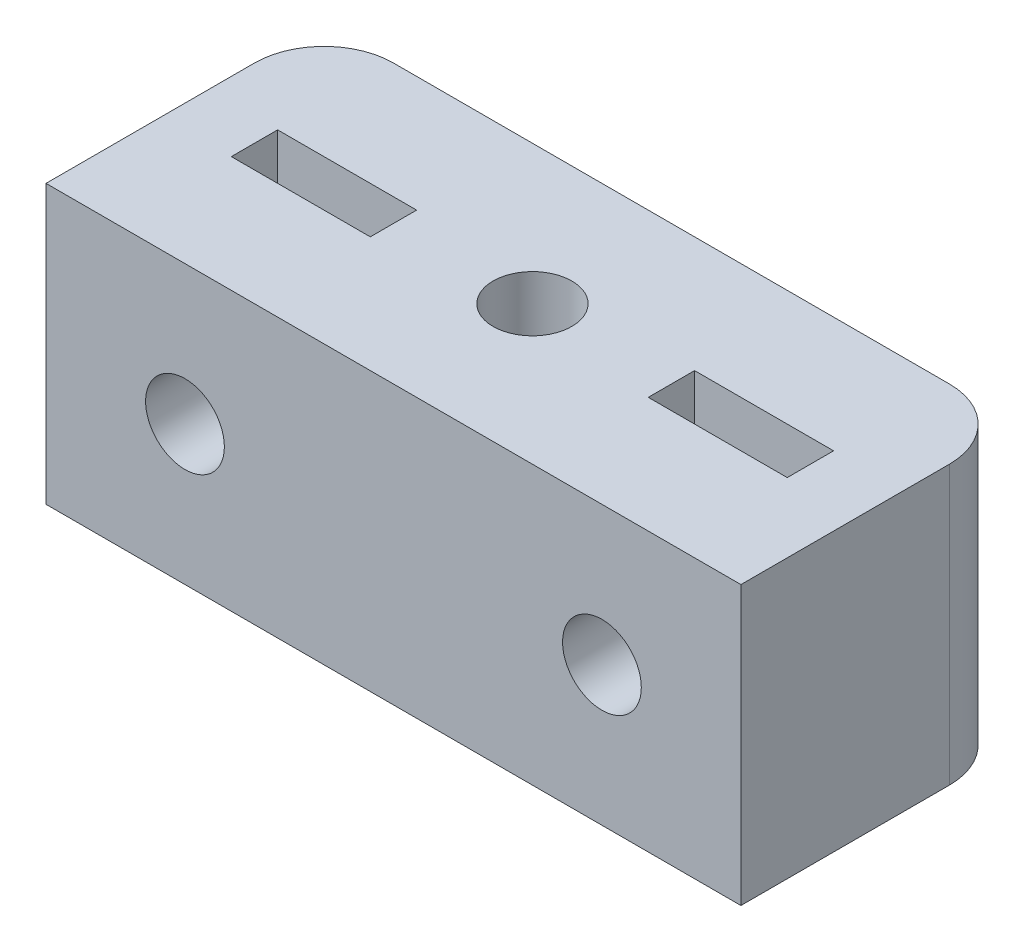
ISO-10303-21;
HEADER;
FILE_DESCRIPTION(('STEP AP214'),'2;1');
FILE_NAME('part.step','',(''),(''),'','','');
FILE_SCHEMA(('AUTOMOTIVE_DESIGN { 1 0 10303 214 1 1 1 1 }'));
ENDSEC;
DATA;
#1=APPLICATION_CONTEXT('core data for automotive mechanical design processes');
#2=APPLICATION_PROTOCOL_DEFINITION('international standard','automotive_design',2000,#1);
#3=PRODUCT_CONTEXT('',#1,'mechanical');
#4=PRODUCT('Part','Part','',(#3));
#5=PRODUCT_RELATED_PRODUCT_CATEGORY('part','',(#4));
#6=PRODUCT_DEFINITION_FORMATION('','',#4);
#7=PRODUCT_DEFINITION_CONTEXT('part definition',#1,'design');
#8=PRODUCT_DEFINITION('design','',#6,#7);
#9=PRODUCT_DEFINITION_SHAPE('','',#8);
#10=(LENGTH_UNIT() NAMED_UNIT(*) SI_UNIT(.MILLI.,.METRE.));
#11=(NAMED_UNIT(*) PLANE_ANGLE_UNIT() SI_UNIT($,.RADIAN.));
#12=(NAMED_UNIT(*) SI_UNIT($,.STERADIAN.) SOLID_ANGLE_UNIT());
#13=UNCERTAINTY_MEASURE_WITH_UNIT(LENGTH_MEASURE(1.E-05),#10,'distance_accuracy_value','');
#14=(GEOMETRIC_REPRESENTATION_CONTEXT(3) GLOBAL_UNCERTAINTY_ASSIGNED_CONTEXT((#13)) GLOBAL_UNIT_ASSIGNED_CONTEXT((#10,
#11,#12)) REPRESENTATION_CONTEXT('',''));
#15=CARTESIAN_POINT('',(0.,0.,0.));
#16=DIRECTION('',(0.,0.,1.));
#17=DIRECTION('',(1.,0.,0.));
#18=AXIS2_PLACEMENT_3D('',#15,#16,#17);
#19=CARTESIAN_POINT('',(-15.,6.,-6.));
#20=DIRECTION('',(0.,0.,1.));
#21=DIRECTION('',(1.,0.,0.));
#22=AXIS2_PLACEMENT_3D('',#19,#20,#21);
#23=PLANE('',#22);
#24=DIRECTION('',(-1.,0.,0.));
#25=VECTOR('',#24,1.);
#26=CARTESIAN_POINT('',(-15.,-6.,-6.));
#27=LINE('',#26,#25);
#28=CARTESIAN_POINT('',(12.,-6.,-6.));
#29=VERTEX_POINT('',#28);
#30=CARTESIAN_POINT('',(-12.,-6.,-6.));
#31=VERTEX_POINT('',#30);
#32=EDGE_CURVE('E298',#29,#31,#27,.T.);
#33=ORIENTED_EDGE('',*,*,#32,.T.);
#34=DIRECTION('',(0.,-1.,0.));
#35=VECTOR('',#34,1.);
#36=CARTESIAN_POINT('',(-12.,6.,-6.));
#37=LINE('',#36,#35);
#38=CARTESIAN_POINT('',(-12.,6.,-6.));
#39=VERTEX_POINT('',#38);
#40=EDGE_CURVE('E53',#31,#39,#37,.F.);
#41=ORIENTED_EDGE('',*,*,#40,.T.);
#42=DIRECTION('',(-1.,0.,0.));
#43=VECTOR('',#42,1.);
#44=CARTESIAN_POINT('',(-15.,6.,-6.));
#45=LINE('',#44,#43);
#46=CARTESIAN_POINT('',(12.,6.,-6.));
#47=VERTEX_POINT('',#46);
#48=EDGE_CURVE('E289',#47,#39,#45,.T.);
#49=ORIENTED_EDGE('',*,*,#48,.F.);
#50=DIRECTION('',(0.,-1.,0.));
#51=VECTOR('',#50,1.);
#52=CARTESIAN_POINT('',(12.,6.,-6.));
#53=LINE('',#52,#51);
#54=EDGE_CURVE('E327',#47,#29,#53,.T.);
#55=ORIENTED_EDGE('',*,*,#54,.T.);
#56=EDGE_LOOP('',(#33,#41,#49,#55));
#57=FACE_BOUND('',#56,.T.);
#58=CARTESIAN_POINT('',(-9.,0.,-6.));
#59=DIRECTION('',(0.,0.,1.));
#60=DIRECTION('',(1.,0.,0.));
#61=AXIS2_PLACEMENT_3D('',#58,#59,#60);
#62=CIRCLE('',#61,1.7);
#63=CARTESIAN_POINT('',(-7.3,0.,-6.));
#64=VERTEX_POINT('',#63);
#65=EDGE_CURVE('E279',#64,#64,#62,.T.);
#66=ORIENTED_EDGE('',*,*,#65,.T.);
#67=EDGE_LOOP('',(#66));
#68=FACE_BOUND('',#67,.T.);
#69=CARTESIAN_POINT('',(9.,0.,-6.));
#70=DIRECTION('',(0.,0.,-1.));
#71=DIRECTION('',(-1.,0.,0.));
#72=AXIS2_PLACEMENT_3D('',#69,#70,#71);
#73=CIRCLE('',#72,1.7);
#74=CARTESIAN_POINT('',(7.3,0.,-6.));
#75=VERTEX_POINT('',#74);
#76=EDGE_CURVE('E240',#75,#75,#73,.T.);
#77=ORIENTED_EDGE('',*,*,#76,.F.);
#78=EDGE_LOOP('',(#77));
#79=FACE_BOUND('',#78,.T.);
#80=DIRECTION('',(-1.,0.,0.));
#81=VECTOR('',#80,1.);
#82=CARTESIAN_POINT('',(-3.,-1.,-6.));
#83=LINE('',#82,#81);
#84=CARTESIAN_POINT('',(3.,-1.,-6.));
#85=VERTEX_POINT('',#84);
#86=CARTESIAN_POINT('',(-3.,-1.,-6.));
#87=VERTEX_POINT('',#86);
#88=EDGE_CURVE('E177',#85,#87,#83,.T.);
#89=ORIENTED_EDGE('',*,*,#88,.F.);
#90=DIRECTION('',(0.,1.,0.));
#91=VECTOR('',#90,1.);
#92=CARTESIAN_POINT('',(3.,-1.,-6.));
#93=LINE('',#92,#91);
#94=CARTESIAN_POINT('',(3.,1.,-6.));
#95=VERTEX_POINT('',#94);
#96=EDGE_CURVE('E158',#85,#95,#93,.T.);
#97=ORIENTED_EDGE('',*,*,#96,.T.);
#98=DIRECTION('',(-1.,0.,0.));
#99=VECTOR('',#98,1.);
#100=CARTESIAN_POINT('',(-3.,1.,-6.));
#101=LINE('',#100,#99);
#102=CARTESIAN_POINT('',(-3.,1.,-6.));
#103=VERTEX_POINT('',#102);
#104=EDGE_CURVE('E186',#95,#103,#101,.T.);
#105=ORIENTED_EDGE('',*,*,#104,.T.);
#106=DIRECTION('',(0.,1.,0.));
#107=VECTOR('',#106,1.);
#108=CARTESIAN_POINT('',(-3.,-1.,-6.));
#109=LINE('',#108,#107);
#110=EDGE_CURVE('E169',#87,#103,#109,.T.);
#111=ORIENTED_EDGE('',*,*,#110,.F.);
#112=EDGE_LOOP('',(#89,#97,#105,#111));
#113=FACE_BOUND('',#112,.T.);
#114=ADVANCED_FACE('F32',(#57,#68,#79,#113),#23,.F.);
#115=CARTESIAN_POINT('',(0.,-6.,0.));
#116=DIRECTION('',(0.,1.,0.));
#117=DIRECTION('',(0.,0.,1.));
#118=AXIS2_PLACEMENT_3D('',#115,#116,#117);
#119=CYLINDRICAL_SURFACE('',#118,1.7);
#120=CARTESIAN_POINT('',(0.,-6.,0.));
#121=DIRECTION('',(0.,1.,0.));
#122=DIRECTION('',(0.,0.,1.));
#123=AXIS2_PLACEMENT_3D('',#120,#121,#122);
#124=CIRCLE('',#123,1.7);
#125=CARTESIAN_POINT('',(0.,-6.,1.7));
#126=VERTEX_POINT('',#125);
#127=EDGE_CURVE('E201',#126,#126,#124,.T.);
#128=ORIENTED_EDGE('',*,*,#127,.F.);
#129=EDGE_LOOP('',(#128));
#130=FACE_BOUND('',#129,.T.);
#131=CARTESIAN_POINT('',(0.,-1.,0.));
#132=DIRECTION('',(0.,1.,0.));
#133=DIRECTION('',(0.,0.,1.));
#134=AXIS2_PLACEMENT_3D('',#131,#132,#133);
#135=CIRCLE('',#134,1.7);
#136=CARTESIAN_POINT('',(0.,-1.,1.7));
#137=VERTEX_POINT('',#136);
#138=EDGE_CURVE('E208',#137,#137,#135,.F.);
#139=ORIENTED_EDGE('',*,*,#138,.F.);
#140=EDGE_LOOP('',(#139));
#141=FACE_BOUND('',#140,.T.);
#142=ADVANCED_FACE('F371',(#130,#141),#119,.F.);
#143=CARTESIAN_POINT('',(0.,6.,0.));
#144=DIRECTION('',(0.,-1.,0.));
#145=DIRECTION('',(0.,0.,-1.));
#146=AXIS2_PLACEMENT_3D('',#143,#144,#145);
#147=PLANE('',#146);
#148=CARTESIAN_POINT('',(0.,6.,0.));
#149=DIRECTION('',(0.,1.,0.));
#150=DIRECTION('',(0.,0.,1.));
#151=AXIS2_PLACEMENT_3D('',#148,#149,#150);
#152=CIRCLE('',#151,1.7);
#153=CARTESIAN_POINT('',(0.,6.,1.7));
#154=VERTEX_POINT('',#153);
#155=EDGE_CURVE('E205',#154,#154,#152,.T.);
#156=ORIENTED_EDGE('',*,*,#155,.F.);
#157=EDGE_LOOP('',(#156));
#158=FACE_BOUND('',#157,.T.);
#159=DIRECTION('',(-1.,0.,0.));
#160=VECTOR('',#159,1.);
#161=CARTESIAN_POINT('',(-12.,6.,-1.));
#162=LINE('',#161,#160);
#163=CARTESIAN_POINT('',(-6.,6.,-1.));
#164=VERTEX_POINT('',#163);
#165=CARTESIAN_POINT('',(-12.,6.,-1.));
#166=VERTEX_POINT('',#165);
#167=EDGE_CURVE('E251',#164,#166,#162,.T.);
#168=ORIENTED_EDGE('',*,*,#167,.F.);
#169=DIRECTION('',(0.,0.,1.));
#170=VECTOR('',#169,1.);
#171=CARTESIAN_POINT('',(-6.,6.,-1.));
#172=LINE('',#171,#170);
#173=CARTESIAN_POINT('',(-6.,6.,1.));
#174=VERTEX_POINT('',#173);
#175=EDGE_CURVE('E260',#164,#174,#172,.T.);
#176=ORIENTED_EDGE('',*,*,#175,.T.);
#177=DIRECTION('',(-1.,0.,0.));
#178=VECTOR('',#177,1.);
#179=CARTESIAN_POINT('',(-12.,6.,1.));
#180=LINE('',#179,#178);
#181=CARTESIAN_POINT('',(-12.,6.,1.));
#182=VERTEX_POINT('',#181);
#183=EDGE_CURVE('E243',#174,#182,#180,.T.);
#184=ORIENTED_EDGE('',*,*,#183,.T.);
#185=DIRECTION('',(0.,0.,1.));
#186=VECTOR('',#185,1.);
#187=CARTESIAN_POINT('',(-12.,6.,-1.));
#188=LINE('',#187,#186);
#189=EDGE_CURVE('E275',#166,#182,#188,.T.);
#190=ORIENTED_EDGE('',*,*,#189,.F.);
#191=EDGE_LOOP('',(#168,#176,#184,#190));
#192=FACE_BOUND('',#191,.T.);
#193=ORIENTED_EDGE('',*,*,#48,.T.);
#194=CARTESIAN_POINT('',(-12.,6.,-3.));
#195=DIRECTION('',(0.,-1.,0.));
#196=DIRECTION('',(0.,0.,-1.));
#197=AXIS2_PLACEMENT_3D('',#194,#195,#196);
#198=CIRCLE('',#197,3.);
#199=CARTESIAN_POINT('',(-15.,6.,-3.));
#200=VERTEX_POINT('',#199);
#201=EDGE_CURVE('E40',#39,#200,#198,.F.);
#202=ORIENTED_EDGE('',*,*,#201,.T.);
#203=DIRECTION('',(0.,0.,1.));
#204=VECTOR('',#203,1.);
#205=CARTESIAN_POINT('',(-15.,6.,6.));
#206=LINE('',#205,#204);
#207=CARTESIAN_POINT('',(-15.,6.,6.));
#208=VERTEX_POINT('',#207);
#209=EDGE_CURVE('E292',#200,#208,#206,.T.);
#210=ORIENTED_EDGE('',*,*,#209,.T.);
#211=DIRECTION('',(1.,0.,0.));
#212=VECTOR('',#211,1.);
#213=CARTESIAN_POINT('',(-15.,6.,6.));
#214=LINE('',#213,#212);
#215=CARTESIAN_POINT('',(15.,6.,6.));
#216=VERTEX_POINT('',#215);
#217=EDGE_CURVE('E294',#208,#216,#214,.T.);
#218=ORIENTED_EDGE('',*,*,#217,.T.);
#219=DIRECTION('',(0.,0.,-1.));
#220=VECTOR('',#219,1.);
#221=CARTESIAN_POINT('',(15.,6.,6.));
#222=LINE('',#221,#220);
#223=CARTESIAN_POINT('',(15.,6.,-3.));
#224=VERTEX_POINT('',#223);
#225=EDGE_CURVE('E287',#216,#224,#222,.T.);
#226=ORIENTED_EDGE('',*,*,#225,.T.);
#227=CARTESIAN_POINT('',(12.,6.,-3.));
#228=DIRECTION('',(0.,-1.,0.));
#229=DIRECTION('',(0.,0.,-1.));
#230=AXIS2_PLACEMENT_3D('',#227,#228,#229);
#231=CIRCLE('',#230,3.);
#232=EDGE_CURVE('E331',#224,#47,#231,.F.);
#233=ORIENTED_EDGE('',*,*,#232,.T.);
#234=EDGE_LOOP('',(#193,#202,#210,#218,#226,#233));
#235=FACE_BOUND('',#234,.T.);
#236=DIRECTION('',(1.,0.,0.));
#237=VECTOR('',#236,1.);
#238=CARTESIAN_POINT('',(12.,6.,-1.));
#239=LINE('',#238,#237);
#240=CARTESIAN_POINT('',(6.,6.,-1.));
#241=VERTEX_POINT('',#240);
#242=CARTESIAN_POINT('',(12.,6.,-1.));
#243=VERTEX_POINT('',#242);
#244=EDGE_CURVE('E218',#241,#243,#239,.T.);
#245=ORIENTED_EDGE('',*,*,#244,.T.);
#246=DIRECTION('',(0.,0.,1.));
#247=VECTOR('',#246,1.);
#248=CARTESIAN_POINT('',(12.,6.,-1.));
#249=LINE('',#248,#247);
#250=CARTESIAN_POINT('',(12.,6.,1.));
#251=VERTEX_POINT('',#250);
#252=EDGE_CURVE('E232',#243,#251,#249,.T.);
#253=ORIENTED_EDGE('',*,*,#252,.T.);
#254=DIRECTION('',(1.,0.,0.));
#255=VECTOR('',#254,1.);
#256=CARTESIAN_POINT('',(12.,6.,1.));
#257=LINE('',#256,#255);
#258=CARTESIAN_POINT('',(6.,6.,1.));
#259=VERTEX_POINT('',#258);
#260=EDGE_CURVE('E213',#259,#251,#257,.T.);
#261=ORIENTED_EDGE('',*,*,#260,.F.);
#262=DIRECTION('',(0.,0.,1.));
#263=VECTOR('',#262,1.);
#264=CARTESIAN_POINT('',(6.,6.,-1.));
#265=LINE('',#264,#263);
#266=EDGE_CURVE('E229',#241,#259,#265,.T.);
#267=ORIENTED_EDGE('',*,*,#266,.F.);
#268=EDGE_LOOP('',(#245,#253,#261,#267));
#269=FACE_BOUND('',#268,.T.);
#270=ADVANCED_FACE('F335',(#158,#192,#235,#269),#147,.F.);
#271=CARTESIAN_POINT('',(9.,0.,-6.));
#272=DIRECTION('',(0.,0.,1.));
#273=DIRECTION('',(1.,0.,0.));
#274=AXIS2_PLACEMENT_3D('',#271,#272,#273);
#275=CYLINDRICAL_SURFACE('',#274,1.7);
#276=ORIENTED_EDGE('',*,*,#76,.T.);
#277=EDGE_LOOP('',(#276));
#278=FACE_BOUND('',#277,.T.);
#279=CARTESIAN_POINT('',(9.,0.,-1.));
#280=DIRECTION('',(0.,0.,1.));
#281=DIRECTION('',(1.,0.,0.));
#282=AXIS2_PLACEMENT_3D('',#279,#280,#281);
#283=CIRCLE('',#282,1.7);
#284=CARTESIAN_POINT('',(10.7,0.,-1.));
#285=VERTEX_POINT('',#284);
#286=EDGE_CURVE('E247',#285,#285,#283,.T.);
#287=ORIENTED_EDGE('',*,*,#286,.T.);
#288=EDGE_LOOP('',(#287));
#289=FACE_BOUND('',#288,.T.);
#290=ADVANCED_FACE('F425',(#278,#289),#275,.F.);
#291=CARTESIAN_POINT('',(-9.,0.,-6.));
#292=DIRECTION('',(0.,0.,1.));
#293=DIRECTION('',(1.,0.,0.));
#294=AXIS2_PLACEMENT_3D('',#291,#292,#293);
#295=CYLINDRICAL_SURFACE('',#294,1.7);
#296=ORIENTED_EDGE('',*,*,#65,.F.);
#297=EDGE_LOOP('',(#296));
#298=FACE_BOUND('',#297,.T.);
#299=CARTESIAN_POINT('',(-9.,0.,-1.));
#300=DIRECTION('',(0.,0.,1.));
#301=DIRECTION('',(1.,0.,0.));
#302=AXIS2_PLACEMENT_3D('',#299,#300,#301);
#303=CIRCLE('',#302,1.7);
#304=CARTESIAN_POINT('',(-7.3,0.,-1.));
#305=VERTEX_POINT('',#304);
#306=EDGE_CURVE('E286',#305,#305,#303,.F.);
#307=ORIENTED_EDGE('',*,*,#306,.F.);
#308=EDGE_LOOP('',(#307));
#309=FACE_BOUND('',#308,.T.);
#310=ADVANCED_FACE('F381',(#298,#309),#295,.F.);
#311=CARTESIAN_POINT('',(15.,6.,6.));
#312=DIRECTION('',(-1.,0.,0.));
#313=DIRECTION('',(0.,0.,1.));
#314=AXIS2_PLACEMENT_3D('',#311,#312,#313);
#315=PLANE('',#314);
#316=DIRECTION('',(0.,0.,-1.));
#317=VECTOR('',#316,1.);
#318=CARTESIAN_POINT('',(15.,-6.,6.));
#319=LINE('',#318,#317);
#320=CARTESIAN_POINT('',(15.,-6.,6.));
#321=VERTEX_POINT('',#320);
#322=CARTESIAN_POINT('',(15.,-6.,-3.));
#323=VERTEX_POINT('',#322);
#324=EDGE_CURVE('E282',#321,#323,#319,.T.);
#325=ORIENTED_EDGE('',*,*,#324,.T.);
#326=DIRECTION('',(0.,-1.,0.));
#327=VECTOR('',#326,1.);
#328=CARTESIAN_POINT('',(15.,6.,-3.));
#329=LINE('',#328,#327);
#330=EDGE_CURVE('E11',#323,#224,#329,.F.);
#331=ORIENTED_EDGE('',*,*,#330,.T.);
#332=ORIENTED_EDGE('',*,*,#225,.F.);
#333=DIRECTION('',(0.,-1.,0.));
#334=VECTOR('',#333,1.);
#335=CARTESIAN_POINT('',(15.,6.,6.));
#336=LINE('',#335,#334);
#337=EDGE_CURVE('E296',#216,#321,#336,.T.);
#338=ORIENTED_EDGE('',*,*,#337,.T.);
#339=EDGE_LOOP('',(#325,#331,#332,#338));
#340=FACE_BOUND('',#339,.T.);
#341=ADVANCED_FACE('F354',(#340),#315,.F.);
#342=CARTESIAN_POINT('',(-15.,6.,6.));
#343=DIRECTION('',(1.,0.,0.));
#344=DIRECTION('',(0.,0.,-1.));
#345=AXIS2_PLACEMENT_3D('',#342,#343,#344);
#346=PLANE('',#345);
#347=ORIENTED_EDGE('',*,*,#209,.F.);
#348=DIRECTION('',(0.,-1.,0.));
#349=VECTOR('',#348,1.);
#350=CARTESIAN_POINT('',(-15.,6.,-3.));
#351=LINE('',#350,#349);
#352=CARTESIAN_POINT('',(-15.,-6.,-3.));
#353=VERTEX_POINT('',#352);
#354=EDGE_CURVE('E308',#200,#353,#351,.T.);
#355=ORIENTED_EDGE('',*,*,#354,.T.);
#356=DIRECTION('',(0.,0.,1.));
#357=VECTOR('',#356,1.);
#358=CARTESIAN_POINT('',(-15.,-6.,6.));
#359=LINE('',#358,#357);
#360=CARTESIAN_POINT('',(-15.,-6.,6.));
#361=VERTEX_POINT('',#360);
#362=EDGE_CURVE('E300',#353,#361,#359,.T.);
#363=ORIENTED_EDGE('',*,*,#362,.T.);
#364=DIRECTION('',(0.,-1.,0.));
#365=VECTOR('',#364,1.);
#366=CARTESIAN_POINT('',(-15.,6.,6.));
#367=LINE('',#366,#365);
#368=EDGE_CURVE('E305',#208,#361,#367,.T.);
#369=ORIENTED_EDGE('',*,*,#368,.F.);
#370=EDGE_LOOP('',(#347,#355,#363,#369));
#371=FACE_BOUND('',#370,.T.);
#372=ADVANCED_FACE('F341',(#371),#346,.F.);
#373=CARTESIAN_POINT('',(-15.,6.,6.));
#374=DIRECTION('',(0.,0.,-1.));
#375=DIRECTION('',(-1.,0.,0.));
#376=AXIS2_PLACEMENT_3D('',#373,#374,#375);
#377=PLANE('',#376);
#378=CARTESIAN_POINT('',(9.,0.,6.));
#379=DIRECTION('',(0.,0.,-1.));
#380=DIRECTION('',(-1.,0.,0.));
#381=AXIS2_PLACEMENT_3D('',#378,#379,#380);
#382=CIRCLE('',#381,1.7);
#383=CARTESIAN_POINT('',(7.3,0.,6.));
#384=VERTEX_POINT('',#383);
#385=EDGE_CURVE('E244',#384,#384,#382,.T.);
#386=ORIENTED_EDGE('',*,*,#385,.T.);
#387=EDGE_LOOP('',(#386));
#388=FACE_BOUND('',#387,.T.);
#389=CARTESIAN_POINT('',(-9.,0.,6.));
#390=DIRECTION('',(0.,0.,1.));
#391=DIRECTION('',(1.,0.,0.));
#392=AXIS2_PLACEMENT_3D('',#389,#390,#391);
#393=CIRCLE('',#392,1.7);
#394=CARTESIAN_POINT('',(-7.3,0.,6.));
#395=VERTEX_POINT('',#394);
#396=EDGE_CURVE('E283',#395,#395,#393,.T.);
#397=ORIENTED_EDGE('',*,*,#396,.F.);
#398=EDGE_LOOP('',(#397));
#399=FACE_BOUND('',#398,.T.);
#400=DIRECTION('',(1.,0.,0.));
#401=VECTOR('',#400,1.);
#402=CARTESIAN_POINT('',(-15.,-6.,6.));
#403=LINE('',#402,#401);
#404=EDGE_CURVE('E290',#361,#321,#403,.T.);
#405=ORIENTED_EDGE('',*,*,#404,.T.);
#406=ORIENTED_EDGE('',*,*,#337,.F.);
#407=ORIENTED_EDGE('',*,*,#217,.F.);
#408=ORIENTED_EDGE('',*,*,#368,.T.);
#409=EDGE_LOOP('',(#405,#406,#407,#408));
#410=FACE_BOUND('',#409,.T.);
#411=ADVANCED_FACE('F357',(#388,#399,#410),#377,.F.);
#412=CARTESIAN_POINT('',(0.,-6.,0.));
#413=DIRECTION('',(0.,-1.,0.));
#414=DIRECTION('',(0.,0.,-1.));
#415=AXIS2_PLACEMENT_3D('',#412,#413,#414);
#416=PLANE('',#415);
#417=ORIENTED_EDGE('',*,*,#127,.T.);
#418=EDGE_LOOP('',(#417));
#419=FACE_BOUND('',#418,.T.);
#420=ORIENTED_EDGE('',*,*,#362,.F.);
#421=CARTESIAN_POINT('',(-12.,-6.,-3.));
#422=DIRECTION('',(0.,-1.,0.));
#423=DIRECTION('',(0.,0.,-1.));
#424=AXIS2_PLACEMENT_3D('',#421,#422,#423);
#425=CIRCLE('',#424,3.);
#426=EDGE_CURVE('E325',#353,#31,#425,.T.);
#427=ORIENTED_EDGE('',*,*,#426,.T.);
#428=ORIENTED_EDGE('',*,*,#32,.F.);
#429=CARTESIAN_POINT('',(12.,-6.,-3.));
#430=DIRECTION('',(0.,-1.,0.));
#431=DIRECTION('',(0.,0.,-1.));
#432=AXIS2_PLACEMENT_3D('',#429,#430,#431);
#433=CIRCLE('',#432,3.);
#434=EDGE_CURVE('E323',#29,#323,#433,.T.);
#435=ORIENTED_EDGE('',*,*,#434,.T.);
#436=ORIENTED_EDGE('',*,*,#324,.F.);
#437=ORIENTED_EDGE('',*,*,#404,.F.);
#438=EDGE_LOOP('',(#420,#427,#428,#435,#436,#437));
#439=FACE_BOUND('',#438,.T.);
#440=ADVANCED_FACE('F347',(#419,#439),#416,.T.);
#441=CARTESIAN_POINT('',(-9.,0.,1.));
#442=DIRECTION('',(0.,0.,1.));
#443=DIRECTION('',(1.,0.,0.));
#444=AXIS2_PLACEMENT_3D('',#441,#442,#443);
#445=CIRCLE('',#444,1.7);
#446=CARTESIAN_POINT('',(-7.3,0.,1.));
#447=VERTEX_POINT('',#446);
#448=EDGE_CURVE('E272',#447,#447,#445,.F.);
#449=ORIENTED_EDGE('',*,*,#448,.T.);
#450=EDGE_LOOP('',(#449));
#451=FACE_BOUND('',#450,.T.);
#452=ORIENTED_EDGE('',*,*,#396,.T.);
#453=EDGE_LOOP('',(#452));
#454=FACE_BOUND('',#453,.T.);
#455=ADVANCED_FACE('F365',(#451,#454),#295,.F.);
#456=CARTESIAN_POINT('',(0.,0.,-1.));
#457=DIRECTION('',(0.,0.,1.));
#458=DIRECTION('',(1.,0.,0.));
#459=AXIS2_PLACEMENT_3D('',#456,#457,#458);
#460=PLANE('',#459);
#461=DIRECTION('',(0.,1.,0.));
#462=VECTOR('',#461,1.);
#463=CARTESIAN_POINT('',(-6.,6.,-1.));
#464=LINE('',#463,#462);
#465=CARTESIAN_POINT('',(-6.,-3.,-1.));
#466=VERTEX_POINT('',#465);
#467=EDGE_CURVE('E248',#466,#164,#464,.T.);
#468=ORIENTED_EDGE('',*,*,#467,.T.);
#469=ORIENTED_EDGE('',*,*,#167,.T.);
#470=DIRECTION('',(0.,-1.,0.));
#471=VECTOR('',#470,1.);
#472=CARTESIAN_POINT('',(-12.,3.,-1.));
#473=LINE('',#472,#471);
#474=CARTESIAN_POINT('',(-12.,-3.,-1.));
#475=VERTEX_POINT('',#474);
#476=EDGE_CURVE('E255',#166,#475,#473,.T.);
#477=ORIENTED_EDGE('',*,*,#476,.T.);
#478=DIRECTION('',(1.,0.,0.));
#479=VECTOR('',#478,1.);
#480=CARTESIAN_POINT('',(-12.,-3.,-1.));
#481=LINE('',#480,#479);
#482=EDGE_CURVE('E257',#475,#466,#481,.T.);
#483=ORIENTED_EDGE('',*,*,#482,.T.);
#484=EDGE_LOOP('',(#468,#469,#477,#483));
#485=FACE_BOUND('',#484,.T.);
#486=ORIENTED_EDGE('',*,*,#306,.T.);
#487=EDGE_LOOP('',(#486));
#488=FACE_BOUND('',#487,.T.);
#489=ADVANCED_FACE('F426',(#485,#488),#460,.T.);
#490=CARTESIAN_POINT('',(0.,0.,1.));
#491=DIRECTION('',(0.,0.,1.));
#492=DIRECTION('',(1.,0.,0.));
#493=AXIS2_PLACEMENT_3D('',#490,#491,#492);
#494=PLANE('',#493);
#495=DIRECTION('',(0.,1.,0.));
#496=VECTOR('',#495,1.);
#497=CARTESIAN_POINT('',(-6.,-3.,1.));
#498=LINE('',#497,#496);
#499=CARTESIAN_POINT('',(-6.,-3.,1.));
#500=VERTEX_POINT('',#499);
#501=EDGE_CURVE('E252',#500,#174,#498,.T.);
#502=ORIENTED_EDGE('',*,*,#501,.F.);
#503=DIRECTION('',(1.,0.,0.));
#504=VECTOR('',#503,1.);
#505=CARTESIAN_POINT('',(-12.,-3.,1.));
#506=LINE('',#505,#504);
#507=CARTESIAN_POINT('',(-12.,-3.,1.));
#508=VERTEX_POINT('',#507);
#509=EDGE_CURVE('E266',#508,#500,#506,.T.);
#510=ORIENTED_EDGE('',*,*,#509,.F.);
#511=DIRECTION('',(0.,-1.,0.));
#512=VECTOR('',#511,1.);
#513=CARTESIAN_POINT('',(-12.,-3.,1.));
#514=LINE('',#513,#512);
#515=EDGE_CURVE('E263',#182,#508,#514,.T.);
#516=ORIENTED_EDGE('',*,*,#515,.F.);
#517=ORIENTED_EDGE('',*,*,#183,.F.);
#518=EDGE_LOOP('',(#502,#510,#516,#517));
#519=FACE_BOUND('',#518,.T.);
#520=ORIENTED_EDGE('',*,*,#448,.F.);
#521=EDGE_LOOP('',(#520));
#522=FACE_BOUND('',#521,.T.);
#523=ADVANCED_FACE('F429',(#519,#522),#494,.F.);
#524=CARTESIAN_POINT('',(-6.,-3.,-1.));
#525=DIRECTION('',(1.,0.,0.));
#526=DIRECTION('',(0.,0.,-1.));
#527=AXIS2_PLACEMENT_3D('',#524,#525,#526);
#528=PLANE('',#527);
#529=ORIENTED_EDGE('',*,*,#501,.T.);
#530=ORIENTED_EDGE('',*,*,#175,.F.);
#531=ORIENTED_EDGE('',*,*,#467,.F.);
#532=DIRECTION('',(0.,0.,1.));
#533=VECTOR('',#532,1.);
#534=CARTESIAN_POINT('',(-6.,-3.,-1.));
#535=LINE('',#534,#533);
#536=EDGE_CURVE('E270',#466,#500,#535,.T.);
#537=ORIENTED_EDGE('',*,*,#536,.T.);
#538=EDGE_LOOP('',(#529,#530,#531,#537));
#539=FACE_BOUND('',#538,.T.);
#540=ADVANCED_FACE('F433',(#539),#528,.F.);
#541=CARTESIAN_POINT('',(-12.,-3.,-1.));
#542=DIRECTION('',(0.,-1.,0.));
#543=DIRECTION('',(0.,0.,-1.));
#544=AXIS2_PLACEMENT_3D('',#541,#542,#543);
#545=PLANE('',#544);
#546=ORIENTED_EDGE('',*,*,#509,.T.);
#547=ORIENTED_EDGE('',*,*,#536,.F.);
#548=ORIENTED_EDGE('',*,*,#482,.F.);
#549=DIRECTION('',(0.,0.,1.));
#550=VECTOR('',#549,1.);
#551=CARTESIAN_POINT('',(-12.,-3.,-1.));
#552=LINE('',#551,#550);
#553=EDGE_CURVE('E273',#475,#508,#552,.T.);
#554=ORIENTED_EDGE('',*,*,#553,.T.);
#555=EDGE_LOOP('',(#546,#547,#548,#554));
#556=FACE_BOUND('',#555,.T.);
#557=ADVANCED_FACE('F437',(#556),#545,.F.);
#558=CARTESIAN_POINT('',(-12.,-3.,-1.));
#559=DIRECTION('',(-1.,0.,0.));
#560=DIRECTION('',(0.,0.,1.));
#561=AXIS2_PLACEMENT_3D('',#558,#559,#560);
#562=PLANE('',#561);
#563=ORIENTED_EDGE('',*,*,#515,.T.);
#564=ORIENTED_EDGE('',*,*,#553,.F.);
#565=ORIENTED_EDGE('',*,*,#476,.F.);
#566=ORIENTED_EDGE('',*,*,#189,.T.);
#567=EDGE_LOOP('',(#563,#564,#565,#566));
#568=FACE_BOUND('',#567,.T.);
#569=ADVANCED_FACE('F423',(#568),#562,.F.);
#570=CARTESIAN_POINT('',(9.,0.,1.));
#571=DIRECTION('',(0.,0.,1.));
#572=DIRECTION('',(1.,0.,0.));
#573=AXIS2_PLACEMENT_3D('',#570,#571,#572);
#574=CIRCLE('',#573,1.7);
#575=CARTESIAN_POINT('',(10.7,0.,1.));
#576=VERTEX_POINT('',#575);
#577=EDGE_CURVE('E231',#576,#576,#574,.T.);
#578=ORIENTED_EDGE('',*,*,#577,.F.);
#579=EDGE_LOOP('',(#578));
#580=FACE_BOUND('',#579,.T.);
#581=ORIENTED_EDGE('',*,*,#385,.F.);
#582=EDGE_LOOP('',(#581));
#583=FACE_BOUND('',#582,.T.);
#584=ADVANCED_FACE('F413',(#580,#583),#275,.F.);
#585=CARTESIAN_POINT('',(12.,3.,-1.));
#586=DIRECTION('',(-1.,0.,0.));
#587=DIRECTION('',(0.,0.,1.));
#588=AXIS2_PLACEMENT_3D('',#585,#586,#587);
#589=PLANE('',#588);
#590=DIRECTION('',(0.,-1.,0.));
#591=VECTOR('',#590,1.);
#592=CARTESIAN_POINT('',(12.,3.,1.));
#593=LINE('',#592,#591);
#594=CARTESIAN_POINT('',(12.,-3.,1.));
#595=VERTEX_POINT('',#594);
#596=EDGE_CURVE('E226',#251,#595,#593,.T.);
#597=ORIENTED_EDGE('',*,*,#596,.F.);
#598=ORIENTED_EDGE('',*,*,#252,.F.);
#599=DIRECTION('',(0.,-1.,0.));
#600=VECTOR('',#599,1.);
#601=CARTESIAN_POINT('',(12.,-3.,-1.));
#602=LINE('',#601,#600);
#603=CARTESIAN_POINT('',(12.,-3.,-1.));
#604=VERTEX_POINT('',#603);
#605=EDGE_CURVE('E216',#243,#604,#602,.T.);
#606=ORIENTED_EDGE('',*,*,#605,.T.);
#607=DIRECTION('',(0.,0.,1.));
#608=VECTOR('',#607,1.);
#609=CARTESIAN_POINT('',(12.,-3.,-1.));
#610=LINE('',#609,#608);
#611=EDGE_CURVE('E235',#604,#595,#610,.T.);
#612=ORIENTED_EDGE('',*,*,#611,.T.);
#613=EDGE_LOOP('',(#597,#598,#606,#612));
#614=FACE_BOUND('',#613,.T.);
#615=ADVANCED_FACE('F409',(#614),#589,.T.);
#616=CARTESIAN_POINT('',(12.,-3.,-1.));
#617=DIRECTION('',(0.,1.,0.));
#618=DIRECTION('',(0.,0.,1.));
#619=AXIS2_PLACEMENT_3D('',#616,#617,#618);
#620=PLANE('',#619);
#621=DIRECTION('',(-1.,0.,0.));
#622=VECTOR('',#621,1.);
#623=CARTESIAN_POINT('',(12.,-3.,1.));
#624=LINE('',#623,#622);
#625=CARTESIAN_POINT('',(6.,-3.,1.));
#626=VERTEX_POINT('',#625);
#627=EDGE_CURVE('E224',#595,#626,#624,.T.);
#628=ORIENTED_EDGE('',*,*,#627,.F.);
#629=ORIENTED_EDGE('',*,*,#611,.F.);
#630=DIRECTION('',(-1.,0.,0.));
#631=VECTOR('',#630,1.);
#632=CARTESIAN_POINT('',(12.,-3.,-1.));
#633=LINE('',#632,#631);
#634=CARTESIAN_POINT('',(6.,-3.,-1.));
#635=VERTEX_POINT('',#634);
#636=EDGE_CURVE('E212',#604,#635,#633,.T.);
#637=ORIENTED_EDGE('',*,*,#636,.T.);
#638=DIRECTION('',(0.,0.,1.));
#639=VECTOR('',#638,1.);
#640=CARTESIAN_POINT('',(6.,-3.,-1.));
#641=LINE('',#640,#639);
#642=EDGE_CURVE('E221',#635,#626,#641,.T.);
#643=ORIENTED_EDGE('',*,*,#642,.T.);
#644=EDGE_LOOP('',(#628,#629,#637,#643));
#645=FACE_BOUND('',#644,.T.);
#646=ADVANCED_FACE('F412',(#645),#620,.T.);
#647=CARTESIAN_POINT('',(6.,-3.,-1.));
#648=DIRECTION('',(1.,0.,0.));
#649=DIRECTION('',(0.,0.,-1.));
#650=AXIS2_PLACEMENT_3D('',#647,#648,#649);
#651=PLANE('',#650);
#652=DIRECTION('',(0.,1.,0.));
#653=VECTOR('',#652,1.);
#654=CARTESIAN_POINT('',(6.,-3.,1.));
#655=LINE('',#654,#653);
#656=EDGE_CURVE('E204',#626,#259,#655,.T.);
#657=ORIENTED_EDGE('',*,*,#656,.F.);
#658=ORIENTED_EDGE('',*,*,#642,.F.);
#659=DIRECTION('',(0.,1.,0.));
#660=VECTOR('',#659,1.);
#661=CARTESIAN_POINT('',(6.,6.,-1.));
#662=LINE('',#661,#660);
#663=EDGE_CURVE('E209',#635,#241,#662,.T.);
#664=ORIENTED_EDGE('',*,*,#663,.T.);
#665=ORIENTED_EDGE('',*,*,#266,.T.);
#666=EDGE_LOOP('',(#657,#658,#664,#665));
#667=FACE_BOUND('',#666,.T.);
#668=ADVANCED_FACE('F404',(#667),#651,.T.);
#669=CARTESIAN_POINT('',(0.,0.,-1.));
#670=DIRECTION('',(0.,0.,1.));
#671=DIRECTION('',(-1.,0.,0.));
#672=AXIS2_PLACEMENT_3D('',#669,#670,#671);
#673=PLANE('',#672);
#674=ORIENTED_EDGE('',*,*,#286,.F.);
#675=EDGE_LOOP('',(#674));
#676=FACE_BOUND('',#675,.T.);
#677=ORIENTED_EDGE('',*,*,#663,.F.);
#678=ORIENTED_EDGE('',*,*,#636,.F.);
#679=ORIENTED_EDGE('',*,*,#605,.F.);
#680=ORIENTED_EDGE('',*,*,#244,.F.);
#681=EDGE_LOOP('',(#677,#678,#679,#680));
#682=FACE_BOUND('',#681,.T.);
#683=ADVANCED_FACE('F401',(#676,#682),#673,.T.);
#684=CARTESIAN_POINT('',(0.,0.,1.));
#685=DIRECTION('',(0.,0.,1.));
#686=DIRECTION('',(-1.,0.,0.));
#687=AXIS2_PLACEMENT_3D('',#684,#685,#686);
#688=PLANE('',#687);
#689=ORIENTED_EDGE('',*,*,#577,.T.);
#690=EDGE_LOOP('',(#689));
#691=FACE_BOUND('',#690,.T.);
#692=ORIENTED_EDGE('',*,*,#260,.T.);
#693=ORIENTED_EDGE('',*,*,#596,.T.);
#694=ORIENTED_EDGE('',*,*,#627,.T.);
#695=ORIENTED_EDGE('',*,*,#656,.T.);
#696=EDGE_LOOP('',(#692,#693,#694,#695));
#697=FACE_BOUND('',#696,.T.);
#698=ADVANCED_FACE('F399',(#691,#697),#688,.F.);
#699=CARTESIAN_POINT('',(0.,1.,0.));
#700=DIRECTION('',(0.,1.,0.));
#701=DIRECTION('',(0.,0.,1.));
#702=AXIS2_PLACEMENT_3D('',#699,#700,#701);
#703=CIRCLE('',#702,1.7);
#704=CARTESIAN_POINT('',(0.,1.,1.7));
#705=VERTEX_POINT('',#704);
#706=EDGE_CURVE('E197',#705,#705,#703,.F.);
#707=ORIENTED_EDGE('',*,*,#706,.T.);
#708=EDGE_LOOP('',(#707));
#709=FACE_BOUND('',#708,.T.);
#710=ORIENTED_EDGE('',*,*,#155,.T.);
#711=EDGE_LOOP('',(#710));
#712=FACE_BOUND('',#711,.T.);
#713=ADVANCED_FACE('F378',(#709,#712),#119,.F.);
#714=CARTESIAN_POINT('',(0.,-1.,0.));
#715=DIRECTION('',(0.,1.,0.));
#716=DIRECTION('',(0.,0.,1.));
#717=AXIS2_PLACEMENT_3D('',#714,#715,#716);
#718=PLANE('',#717);
#719=DIRECTION('',(0.,0.,-1.));
#720=VECTOR('',#719,1.);
#721=CARTESIAN_POINT('',(3.,-1.,-6.));
#722=LINE('',#721,#720);
#723=CARTESIAN_POINT('',(3.,-1.,3.));
#724=VERTEX_POINT('',#723);
#725=EDGE_CURVE('E161',#724,#85,#722,.T.);
#726=ORIENTED_EDGE('',*,*,#725,.T.);
#727=ORIENTED_EDGE('',*,*,#88,.T.);
#728=DIRECTION('',(0.,0.,1.));
#729=VECTOR('',#728,1.);
#730=CARTESIAN_POINT('',(-3.,-1.,-3.));
#731=LINE('',#730,#729);
#732=CARTESIAN_POINT('',(-3.,-1.,3.));
#733=VERTEX_POINT('',#732);
#734=EDGE_CURVE('E181',#87,#733,#731,.T.);
#735=ORIENTED_EDGE('',*,*,#734,.T.);
#736=DIRECTION('',(1.,0.,0.));
#737=VECTOR('',#736,1.);
#738=CARTESIAN_POINT('',(-3.,-1.,3.));
#739=LINE('',#738,#737);
#740=EDGE_CURVE('E170',#733,#724,#739,.T.);
#741=ORIENTED_EDGE('',*,*,#740,.T.);
#742=EDGE_LOOP('',(#726,#727,#735,#741));
#743=FACE_BOUND('',#742,.T.);
#744=ORIENTED_EDGE('',*,*,#138,.T.);
#745=EDGE_LOOP('',(#744));
#746=FACE_BOUND('',#745,.T.);
#747=ADVANCED_FACE('F175',(#743,#746),#718,.T.);
#748=CARTESIAN_POINT('',(0.,1.,0.));
#749=DIRECTION('',(0.,1.,0.));
#750=DIRECTION('',(0.,0.,1.));
#751=AXIS2_PLACEMENT_3D('',#748,#749,#750);
#752=PLANE('',#751);
#753=DIRECTION('',(0.,0.,-1.));
#754=VECTOR('',#753,1.);
#755=CARTESIAN_POINT('',(3.,1.,3.));
#756=LINE('',#755,#754);
#757=CARTESIAN_POINT('',(3.,1.,3.));
#758=VERTEX_POINT('',#757);
#759=EDGE_CURVE('E164',#758,#95,#756,.T.);
#760=ORIENTED_EDGE('',*,*,#759,.F.);
#761=DIRECTION('',(1.,0.,0.));
#762=VECTOR('',#761,1.);
#763=CARTESIAN_POINT('',(-3.,1.,3.));
#764=LINE('',#763,#762);
#765=CARTESIAN_POINT('',(-3.,1.,3.));
#766=VERTEX_POINT('',#765);
#767=EDGE_CURVE('E191',#766,#758,#764,.T.);
#768=ORIENTED_EDGE('',*,*,#767,.F.);
#769=DIRECTION('',(0.,0.,1.));
#770=VECTOR('',#769,1.);
#771=CARTESIAN_POINT('',(-3.,1.,3.));
#772=LINE('',#771,#770);
#773=EDGE_CURVE('E188',#103,#766,#772,.T.);
#774=ORIENTED_EDGE('',*,*,#773,.F.);
#775=ORIENTED_EDGE('',*,*,#104,.F.);
#776=EDGE_LOOP('',(#760,#768,#774,#775));
#777=FACE_BOUND('',#776,.T.);
#778=ORIENTED_EDGE('',*,*,#706,.F.);
#779=EDGE_LOOP('',(#778));
#780=FACE_BOUND('',#779,.T.);
#781=ADVANCED_FACE('F597',(#777,#780),#752,.F.);
#782=CARTESIAN_POINT('',(3.,-1.,3.));
#783=DIRECTION('',(1.,0.,0.));
#784=DIRECTION('',(0.,0.,-1.));
#785=AXIS2_PLACEMENT_3D('',#782,#783,#784);
#786=PLANE('',#785);
#787=ORIENTED_EDGE('',*,*,#759,.T.);
#788=ORIENTED_EDGE('',*,*,#96,.F.);
#789=ORIENTED_EDGE('',*,*,#725,.F.);
#790=DIRECTION('',(0.,1.,0.));
#791=VECTOR('',#790,1.);
#792=CARTESIAN_POINT('',(3.,-1.,3.));
#793=LINE('',#792,#791);
#794=EDGE_CURVE('E195',#724,#758,#793,.T.);
#795=ORIENTED_EDGE('',*,*,#794,.T.);
#796=EDGE_LOOP('',(#787,#788,#789,#795));
#797=FACE_BOUND('',#796,.T.);
#798=ADVANCED_FACE('F160',(#797),#786,.F.);
#799=CARTESIAN_POINT('',(-3.,-1.,3.));
#800=DIRECTION('',(0.,0.,1.));
#801=DIRECTION('',(1.,0.,0.));
#802=AXIS2_PLACEMENT_3D('',#799,#800,#801);
#803=PLANE('',#802);
#804=ORIENTED_EDGE('',*,*,#767,.T.);
#805=ORIENTED_EDGE('',*,*,#794,.F.);
#806=ORIENTED_EDGE('',*,*,#740,.F.);
#807=DIRECTION('',(0.,1.,0.));
#808=VECTOR('',#807,1.);
#809=CARTESIAN_POINT('',(-3.,-1.,3.));
#810=LINE('',#809,#808);
#811=EDGE_CURVE('E198',#733,#766,#810,.T.);
#812=ORIENTED_EDGE('',*,*,#811,.T.);
#813=EDGE_LOOP('',(#804,#805,#806,#812));
#814=FACE_BOUND('',#813,.T.);
#815=ADVANCED_FACE('F388',(#814),#803,.F.);
#816=CARTESIAN_POINT('',(-3.,-1.,3.));
#817=DIRECTION('',(-1.,0.,0.));
#818=DIRECTION('',(0.,0.,1.));
#819=AXIS2_PLACEMENT_3D('',#816,#817,#818);
#820=PLANE('',#819);
#821=ORIENTED_EDGE('',*,*,#773,.T.);
#822=ORIENTED_EDGE('',*,*,#811,.F.);
#823=ORIENTED_EDGE('',*,*,#734,.F.);
#824=ORIENTED_EDGE('',*,*,#110,.T.);
#825=EDGE_LOOP('',(#821,#822,#823,#824));
#826=FACE_BOUND('',#825,.T.);
#827=ADVANCED_FACE('F383',(#826),#820,.F.);
#828=CARTESIAN_POINT('',(-12.,6.,-3.));
#829=DIRECTION('',(0.,-1.,0.));
#830=DIRECTION('',(0.,0.,-1.));
#831=AXIS2_PLACEMENT_3D('',#828,#829,#830);
#832=CYLINDRICAL_SURFACE('',#831,3.);
#833=ORIENTED_EDGE('',*,*,#201,.F.);
#834=ORIENTED_EDGE('',*,*,#40,.F.);
#835=ORIENTED_EDGE('',*,*,#426,.F.);
#836=ORIENTED_EDGE('',*,*,#354,.F.);
#837=EDGE_LOOP('',(#833,#834,#835,#836));
#838=FACE_BOUND('',#837,.T.);
#839=ADVANCED_FACE('F344',(#838),#832,.T.);
#840=CARTESIAN_POINT('',(12.,6.,-3.));
#841=DIRECTION('',(0.,-1.,0.));
#842=DIRECTION('',(0.,0.,-1.));
#843=AXIS2_PLACEMENT_3D('',#840,#841,#842);
#844=CYLINDRICAL_SURFACE('',#843,3.);
#845=ORIENTED_EDGE('',*,*,#232,.F.);
#846=ORIENTED_EDGE('',*,*,#330,.F.);
#847=ORIENTED_EDGE('',*,*,#434,.F.);
#848=ORIENTED_EDGE('',*,*,#54,.F.);
#849=EDGE_LOOP('',(#845,#846,#847,#848));
#850=FACE_BOUND('',#849,.T.);
#851=ADVANCED_FACE('F34',(#850),#844,.T.);
#852=CLOSED_SHELL('',(#114,#142,#270,#290,#310,#341,#372,#411,#440,#455,#489,#523,#540,#557,
#569,#584,#615,#646,#668,#683,#698,#713,#747,#781,#798,#815,#827,#839,#851));
#853=MANIFOLD_SOLID_BREP('B2',#852);
#854=ADVANCED_BREP_SHAPE_REPRESENTATION('',(#18,#853),#14);
#855=SHAPE_DEFINITION_REPRESENTATION(#9,#854);
ENDSEC;
END-ISO-10303-21;
